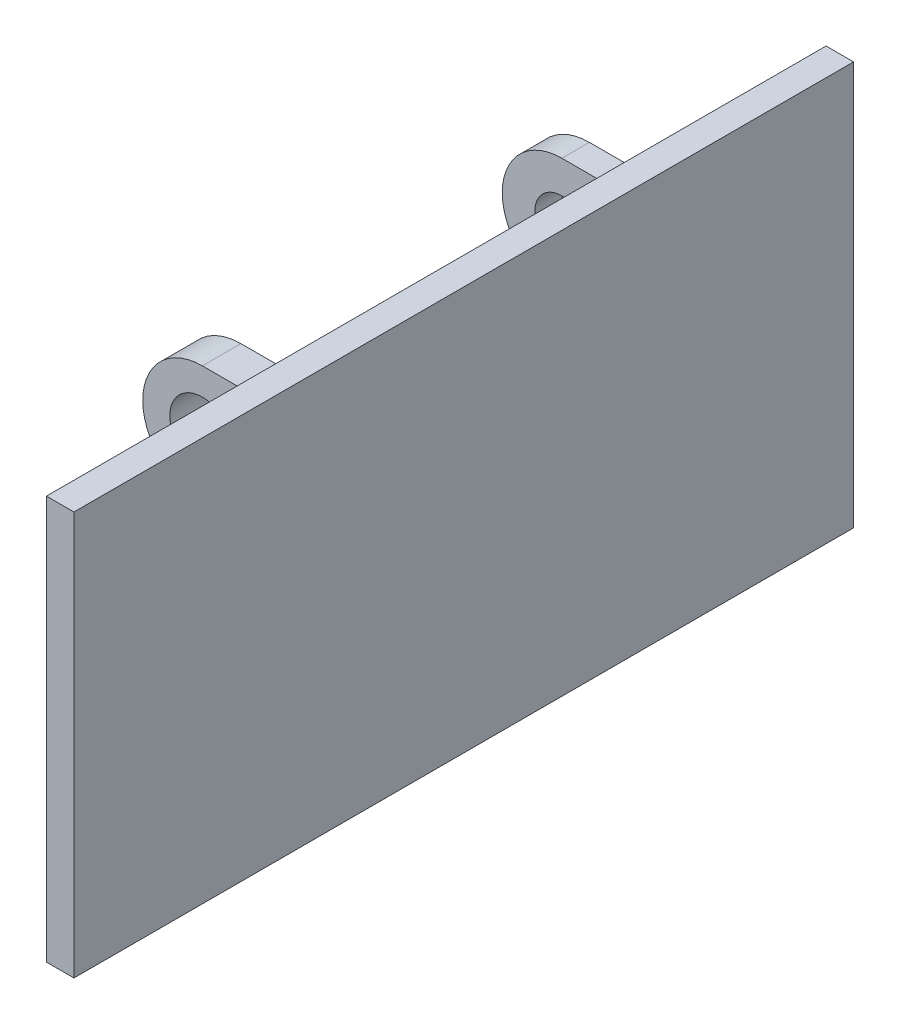
ISO-10303-21;
HEADER;
FILE_DESCRIPTION(('STEP AP214'),'2;1');
FILE_NAME('part.step','',(''),(''),'','','');
FILE_SCHEMA(('AUTOMOTIVE_DESIGN { 1 0 10303 214 1 1 1 1 }'));
ENDSEC;
DATA;
#1=APPLICATION_CONTEXT('core data for automotive mechanical design processes');
#2=APPLICATION_PROTOCOL_DEFINITION('international standard','automotive_design',2000,#1);
#3=PRODUCT_CONTEXT('',#1,'mechanical');
#4=PRODUCT('Part','Part','',(#3));
#5=PRODUCT_RELATED_PRODUCT_CATEGORY('part','',(#4));
#6=PRODUCT_DEFINITION_FORMATION('','',#4);
#7=PRODUCT_DEFINITION_CONTEXT('part definition',#1,'design');
#8=PRODUCT_DEFINITION('design','',#6,#7);
#9=PRODUCT_DEFINITION_SHAPE('','',#8);
#10=(LENGTH_UNIT() NAMED_UNIT(*) SI_UNIT(.MILLI.,.METRE.));
#11=(NAMED_UNIT(*) PLANE_ANGLE_UNIT() SI_UNIT($,.RADIAN.));
#12=(NAMED_UNIT(*) SI_UNIT($,.STERADIAN.) SOLID_ANGLE_UNIT());
#13=UNCERTAINTY_MEASURE_WITH_UNIT(LENGTH_MEASURE(1.E-05),#10,'distance_accuracy_value','');
#14=(GEOMETRIC_REPRESENTATION_CONTEXT(3) GLOBAL_UNCERTAINTY_ASSIGNED_CONTEXT((#13)) GLOBAL_UNIT_ASSIGNED_CONTEXT((#10,
#11,#12)) REPRESENTATION_CONTEXT('',''));
#15=CARTESIAN_POINT('',(0.,0.,0.));
#16=DIRECTION('',(0.,0.,1.));
#17=DIRECTION('',(1.,0.,0.));
#18=AXIS2_PLACEMENT_3D('',#15,#16,#17);
#19=CARTESIAN_POINT('',(122.,0.,0.));
#20=DIRECTION('',(-1.,0.,0.));
#21=DIRECTION('',(0.,0.,1.));
#22=AXIS2_PLACEMENT_3D('',#19,#20,#21);
#23=PLANE('',#22);
#24=DIRECTION('',(0.,-1.,0.));
#25=VECTOR('',#24,1.);
#26=CARTESIAN_POINT('',(122.,-46.,47.));
#27=LINE('',#26,#25);
#28=CARTESIAN_POINT('',(122.,-2.,47.));
#29=VERTEX_POINT('',#28);
#30=CARTESIAN_POINT('',(122.,-46.,47.));
#31=VERTEX_POINT('',#30);
#32=EDGE_CURVE('E261',#29,#31,#27,.T.);
#33=ORIENTED_EDGE('',*,*,#32,.F.);
#34=DIRECTION('',(0.,0.,1.));
#35=VECTOR('',#34,1.);
#36=CARTESIAN_POINT('',(122.,-2.,47.));
#37=LINE('',#36,#35);
#38=CARTESIAN_POINT('',(122.,-2.,-38.));
#39=VERTEX_POINT('',#38);
#40=EDGE_CURVE('E267',#39,#29,#37,.T.);
#41=ORIENTED_EDGE('',*,*,#40,.F.);
#42=DIRECTION('',(0.,1.,0.));
#43=VECTOR('',#42,1.);
#44=CARTESIAN_POINT('',(122.,-46.,-38.));
#45=LINE('',#44,#43);
#46=CARTESIAN_POINT('',(122.,-46.,-38.));
#47=VERTEX_POINT('',#46);
#48=EDGE_CURVE('E283',#47,#39,#45,.T.);
#49=ORIENTED_EDGE('',*,*,#48,.F.);
#50=DIRECTION('',(0.,0.,-1.));
#51=VECTOR('',#50,1.);
#52=CARTESIAN_POINT('',(122.,-46.,47.));
#53=LINE('',#52,#51);
#54=EDGE_CURVE('E280',#31,#47,#53,.T.);
#55=ORIENTED_EDGE('',*,*,#54,.F.);
#56=EDGE_LOOP('',(#33,#41,#49,#55));
#57=FACE_BOUND('',#56,.T.);
#58=DIRECTION('',(0.,0.,1.));
#59=VECTOR('',#58,1.);
#60=CARTESIAN_POINT('',(122.,-12.,0.));
#61=LINE('',#60,#59);
#62=CARTESIAN_POINT('',(122.,-12.,12.));
#63=VERTEX_POINT('',#62);
#64=CARTESIAN_POINT('',(122.,-12.,16.2));
#65=VERTEX_POINT('',#64);
#66=EDGE_CURVE('E307',#63,#65,#61,.T.);
#67=ORIENTED_EDGE('',*,*,#66,.T.);
#68=DIRECTION('',(0.,-1.,0.));
#69=VECTOR('',#68,1.);
#70=CARTESIAN_POINT('',(122.,0.,16.2));
#71=LINE('',#70,#69);
#72=CARTESIAN_POINT('',(122.,-25.,16.2));
#73=VERTEX_POINT('',#72);
#74=EDGE_CURVE('E313',#65,#73,#71,.T.);
#75=ORIENTED_EDGE('',*,*,#74,.T.);
#76=DIRECTION('',(0.,0.,-1.));
#77=VECTOR('',#76,1.);
#78=CARTESIAN_POINT('',(122.,-25.,0.));
#79=LINE('',#78,#77);
#80=CARTESIAN_POINT('',(122.,-25.,12.));
#81=VERTEX_POINT('',#80);
#82=EDGE_CURVE('E310',#73,#81,#79,.T.);
#83=ORIENTED_EDGE('',*,*,#82,.T.);
#84=DIRECTION('',(0.,-1.,0.));
#85=VECTOR('',#84,1.);
#86=CARTESIAN_POINT('',(122.,0.,12.));
#87=LINE('',#86,#85);
#88=EDGE_CURVE('E303',#63,#81,#87,.T.);
#89=ORIENTED_EDGE('',*,*,#88,.F.);
#90=EDGE_LOOP('',(#67,#75,#83,#89));
#91=FACE_BOUND('',#90,.T.);
#92=DIRECTION('',(0.,0.,1.));
#93=VECTOR('',#92,1.);
#94=CARTESIAN_POINT('',(122.,-12.,0.));
#95=LINE('',#94,#93);
#96=CARTESIAN_POINT('',(122.,-12.,-26.));
#97=VERTEX_POINT('',#96);
#98=CARTESIAN_POINT('',(122.,-12.,-23.));
#99=VERTEX_POINT('',#98);
#100=EDGE_CURVE('E58',#97,#99,#95,.T.);
#101=ORIENTED_EDGE('',*,*,#100,.T.);
#102=DIRECTION('',(0.,-1.,0.));
#103=VECTOR('',#102,1.);
#104=CARTESIAN_POINT('',(122.,0.,-23.));
#105=LINE('',#104,#103);
#106=CARTESIAN_POINT('',(122.,-25.,-23.));
#107=VERTEX_POINT('',#106);
#108=EDGE_CURVE('E11',#99,#107,#105,.T.);
#109=ORIENTED_EDGE('',*,*,#108,.T.);
#110=DIRECTION('',(0.,0.,-1.));
#111=VECTOR('',#110,1.);
#112=CARTESIAN_POINT('',(122.,-25.,0.));
#113=LINE('',#112,#111);
#114=CARTESIAN_POINT('',(122.,-25.,-26.));
#115=VERTEX_POINT('',#114);
#116=EDGE_CURVE('E48',#107,#115,#113,.T.);
#117=ORIENTED_EDGE('',*,*,#116,.T.);
#118=DIRECTION('',(0.,-1.,0.));
#119=VECTOR('',#118,1.);
#120=CARTESIAN_POINT('',(122.,0.,-26.));
#121=LINE('',#120,#119);
#122=EDGE_CURVE('E324',#97,#115,#121,.T.);
#123=ORIENTED_EDGE('',*,*,#122,.F.);
#124=EDGE_LOOP('',(#101,#109,#117,#123));
#125=FACE_BOUND('',#124,.T.);
#126=ADVANCED_FACE('F39',(#57,#91,#125),#23,.T.);
#127=CARTESIAN_POINT('',(125.,-46.,47.));
#128=DIRECTION('',(0.,0.,-1.));
#129=DIRECTION('',(-1.,0.,0.));
#130=AXIS2_PLACEMENT_3D('',#127,#128,#129);
#131=PLANE('',#130);
#132=ORIENTED_EDGE('',*,*,#32,.T.);
#133=DIRECTION('',(-1.,0.,0.));
#134=VECTOR('',#133,1.);
#135=CARTESIAN_POINT('',(125.,-46.,47.));
#136=LINE('',#135,#134);
#137=CARTESIAN_POINT('',(125.,-46.,47.));
#138=VERTEX_POINT('',#137);
#139=EDGE_CURVE('E299',#138,#31,#136,.T.);
#140=ORIENTED_EDGE('',*,*,#139,.F.);
#141=DIRECTION('',(0.,-1.,0.));
#142=VECTOR('',#141,1.);
#143=CARTESIAN_POINT('',(125.,-46.,47.));
#144=LINE('',#143,#142);
#145=CARTESIAN_POINT('',(125.,-2.,47.));
#146=VERTEX_POINT('',#145);
#147=EDGE_CURVE('E262',#146,#138,#144,.T.);
#148=ORIENTED_EDGE('',*,*,#147,.F.);
#149=DIRECTION('',(-1.,0.,0.));
#150=VECTOR('',#149,1.);
#151=CARTESIAN_POINT('',(125.,-2.,47.));
#152=LINE('',#151,#150);
#153=EDGE_CURVE('E276',#146,#29,#152,.T.);
#154=ORIENTED_EDGE('',*,*,#153,.T.);
#155=EDGE_LOOP('',(#132,#140,#148,#154));
#156=FACE_BOUND('',#155,.T.);
#157=ADVANCED_FACE('F41',(#156),#131,.F.);
#158=CARTESIAN_POINT('',(125.,-46.,47.));
#159=DIRECTION('',(0.,1.,0.));
#160=DIRECTION('',(0.,0.,1.));
#161=AXIS2_PLACEMENT_3D('',#158,#159,#160);
#162=PLANE('',#161);
#163=ORIENTED_EDGE('',*,*,#54,.T.);
#164=DIRECTION('',(-1.,0.,0.));
#165=VECTOR('',#164,1.);
#166=CARTESIAN_POINT('',(125.,-46.,-38.));
#167=LINE('',#166,#165);
#168=CARTESIAN_POINT('',(125.,-46.,-38.));
#169=VERTEX_POINT('',#168);
#170=EDGE_CURVE('E295',#169,#47,#167,.T.);
#171=ORIENTED_EDGE('',*,*,#170,.F.);
#172=DIRECTION('',(0.,0.,-1.));
#173=VECTOR('',#172,1.);
#174=CARTESIAN_POINT('',(125.,-46.,47.));
#175=LINE('',#174,#173);
#176=EDGE_CURVE('E266',#138,#169,#175,.T.);
#177=ORIENTED_EDGE('',*,*,#176,.F.);
#178=ORIENTED_EDGE('',*,*,#139,.T.);
#179=EDGE_LOOP('',(#163,#171,#177,#178));
#180=FACE_BOUND('',#179,.T.);
#181=ADVANCED_FACE('F351',(#180),#162,.F.);
#182=CARTESIAN_POINT('',(125.,-46.,-38.));
#183=DIRECTION('',(0.,0.,1.));
#184=DIRECTION('',(1.,0.,0.));
#185=AXIS2_PLACEMENT_3D('',#182,#183,#184);
#186=PLANE('',#185);
#187=ORIENTED_EDGE('',*,*,#48,.T.);
#188=DIRECTION('',(-1.,0.,0.));
#189=VECTOR('',#188,1.);
#190=CARTESIAN_POINT('',(125.,-2.,-38.));
#191=LINE('',#190,#189);
#192=CARTESIAN_POINT('',(125.,-2.,-38.));
#193=VERTEX_POINT('',#192);
#194=EDGE_CURVE('E291',#193,#39,#191,.T.);
#195=ORIENTED_EDGE('',*,*,#194,.F.);
#196=DIRECTION('',(0.,1.,0.));
#197=VECTOR('',#196,1.);
#198=CARTESIAN_POINT('',(125.,-46.,-38.));
#199=LINE('',#198,#197);
#200=EDGE_CURVE('E270',#169,#193,#199,.T.);
#201=ORIENTED_EDGE('',*,*,#200,.F.);
#202=ORIENTED_EDGE('',*,*,#170,.T.);
#203=EDGE_LOOP('',(#187,#195,#201,#202));
#204=FACE_BOUND('',#203,.T.);
#205=ADVANCED_FACE('F362',(#204),#186,.F.);
#206=CARTESIAN_POINT('',(125.,-2.,47.));
#207=DIRECTION('',(0.,-1.,0.));
#208=DIRECTION('',(0.,0.,-1.));
#209=AXIS2_PLACEMENT_3D('',#206,#207,#208);
#210=PLANE('',#209);
#211=ORIENTED_EDGE('',*,*,#40,.T.);
#212=ORIENTED_EDGE('',*,*,#153,.F.);
#213=DIRECTION('',(0.,0.,1.));
#214=VECTOR('',#213,1.);
#215=CARTESIAN_POINT('',(125.,-2.,47.));
#216=LINE('',#215,#214);
#217=EDGE_CURVE('E273',#193,#146,#216,.T.);
#218=ORIENTED_EDGE('',*,*,#217,.F.);
#219=ORIENTED_EDGE('',*,*,#194,.T.);
#220=EDGE_LOOP('',(#211,#212,#218,#219));
#221=FACE_BOUND('',#220,.T.);
#222=ADVANCED_FACE('F359',(#221),#210,.F.);
#223=CARTESIAN_POINT('',(125.,0.,0.));
#224=DIRECTION('',(-1.,0.,0.));
#225=DIRECTION('',(0.,0.,1.));
#226=AXIS2_PLACEMENT_3D('',#223,#224,#225);
#227=PLANE('',#226);
#228=ORIENTED_EDGE('',*,*,#147,.T.);
#229=ORIENTED_EDGE('',*,*,#176,.T.);
#230=ORIENTED_EDGE('',*,*,#200,.T.);
#231=ORIENTED_EDGE('',*,*,#217,.T.);
#232=EDGE_LOOP('',(#228,#229,#230,#231));
#233=FACE_BOUND('',#232,.T.);
#234=ADVANCED_FACE('F357',(#233),#227,.F.);
#235=CARTESIAN_POINT('',(108.2,-25.,16.2));
#236=DIRECTION('',(0.,1.,0.));
#237=DIRECTION('',(0.,0.,1.));
#238=AXIS2_PLACEMENT_3D('',#235,#236,#237);
#239=PLANE('',#238);
#240=ORIENTED_EDGE('',*,*,#82,.F.);
#241=DIRECTION('',(1.,0.,0.));
#242=VECTOR('',#241,1.);
#243=CARTESIAN_POINT('',(108.2,-25.,16.2));
#244=LINE('',#243,#242);
#245=CARTESIAN_POINT('',(108.2,-25.,16.2));
#246=VERTEX_POINT('',#245);
#247=EDGE_CURVE('E240',#246,#73,#244,.T.);
#248=ORIENTED_EDGE('',*,*,#247,.F.);
#249=DIRECTION('',(0.,0.,-1.));
#250=VECTOR('',#249,1.);
#251=CARTESIAN_POINT('',(108.2,-25.,16.2));
#252=LINE('',#251,#250);
#253=CARTESIAN_POINT('',(108.2,-25.,12.));
#254=VERTEX_POINT('',#253);
#255=EDGE_CURVE('E257',#246,#254,#252,.T.);
#256=ORIENTED_EDGE('',*,*,#255,.T.);
#257=DIRECTION('',(1.,0.,0.));
#258=VECTOR('',#257,1.);
#259=CARTESIAN_POINT('',(108.2,-25.,12.));
#260=LINE('',#259,#258);
#261=EDGE_CURVE('E236',#254,#81,#260,.T.);
#262=ORIENTED_EDGE('',*,*,#261,.T.);
#263=EDGE_LOOP('',(#240,#248,#256,#262));
#264=FACE_BOUND('',#263,.T.);
#265=ADVANCED_FACE('F381',(#264),#239,.F.);
#266=CARTESIAN_POINT('',(108.2,-12.,16.2));
#267=DIRECTION('',(0.,-1.,0.));
#268=DIRECTION('',(0.,0.,-1.));
#269=AXIS2_PLACEMENT_3D('',#266,#267,#268);
#270=PLANE('',#269);
#271=ORIENTED_EDGE('',*,*,#66,.F.);
#272=DIRECTION('',(-1.,0.,0.));
#273=VECTOR('',#272,1.);
#274=CARTESIAN_POINT('',(108.2,-12.,12.));
#275=LINE('',#274,#273);
#276=CARTESIAN_POINT('',(108.2,-12.,12.));
#277=VERTEX_POINT('',#276);
#278=EDGE_CURVE('E245',#63,#277,#275,.T.);
#279=ORIENTED_EDGE('',*,*,#278,.T.);
#280=DIRECTION('',(0.,0.,-1.));
#281=VECTOR('',#280,1.);
#282=CARTESIAN_POINT('',(108.2,-12.,16.2));
#283=LINE('',#282,#281);
#284=CARTESIAN_POINT('',(108.2,-12.,16.2));
#285=VERTEX_POINT('',#284);
#286=EDGE_CURVE('E248',#285,#277,#283,.T.);
#287=ORIENTED_EDGE('',*,*,#286,.F.);
#288=DIRECTION('',(-1.,0.,0.));
#289=VECTOR('',#288,1.);
#290=CARTESIAN_POINT('',(108.2,-12.,16.2));
#291=LINE('',#290,#289);
#292=EDGE_CURVE('E244',#65,#285,#291,.T.);
#293=ORIENTED_EDGE('',*,*,#292,.F.);
#294=EDGE_LOOP('',(#271,#279,#287,#293));
#295=FACE_BOUND('',#294,.T.);
#296=ADVANCED_FACE('F385',(#295),#270,.F.);
#297=CARTESIAN_POINT('',(0.,0.,16.2));
#298=DIRECTION('',(0.,0.,-1.));
#299=DIRECTION('',(-1.,0.,0.));
#300=AXIS2_PLACEMENT_3D('',#297,#298,#299);
#301=PLANE('',#300);
#302=CARTESIAN_POINT('',(108.2,-18.5,16.2));
#303=DIRECTION('',(0.,0.,1.));
#304=DIRECTION('',(1.,0.,0.));
#305=AXIS2_PLACEMENT_3D('',#302,#303,#304);
#306=CIRCLE('',#305,3.55);
#307=CARTESIAN_POINT('',(108.835894584196,-15.0074167042445,16.2));
#308=VERTEX_POINT('',#307);
#309=CARTESIAN_POINT('',(108.835894584196,-21.9925832957554,16.2));
#310=VERTEX_POINT('',#309);
#311=EDGE_CURVE('E222',#308,#310,#306,.T.);
#312=ORIENTED_EDGE('',*,*,#311,.F.);
#313=DIRECTION('',(-0.995948362239352,0.0899269689956982,0.));
#314=VECTOR('',#313,1.);
#315=CARTESIAN_POINT('',(108.2,-14.95,16.2));
#316=LINE('',#315,#314);
#317=CARTESIAN_POINT('',(120.9,-16.0967185946041,16.2));
#318=VERTEX_POINT('',#317);
#319=EDGE_CURVE('E202',#318,#308,#316,.T.);
#320=ORIENTED_EDGE('',*,*,#319,.F.);
#321=DIRECTION('',(0.,1.,0.));
#322=VECTOR('',#321,1.);
#323=CARTESIAN_POINT('',(120.9,-16.0967185946041,16.2));
#324=LINE('',#323,#322);
#325=CARTESIAN_POINT('',(120.9,-20.9032814053959,16.2));
#326=VERTEX_POINT('',#325);
#327=EDGE_CURVE('E213',#326,#318,#324,.T.);
#328=ORIENTED_EDGE('',*,*,#327,.F.);
#329=DIRECTION('',(0.995948362239352,0.0899269689956982,0.));
#330=VECTOR('',#329,1.);
#331=CARTESIAN_POINT('',(120.9,-20.9032814053959,16.2));
#332=LINE('',#331,#330);
#333=EDGE_CURVE('E196',#310,#326,#332,.T.);
#334=ORIENTED_EDGE('',*,*,#333,.F.);
#335=EDGE_LOOP('',(#312,#320,#328,#334));
#336=FACE_BOUND('',#335,.T.);
#337=ORIENTED_EDGE('',*,*,#292,.T.);
#338=CARTESIAN_POINT('',(108.2,-18.5,16.2));
#339=DIRECTION('',(0.,0.,1.));
#340=DIRECTION('',(1.,0.,0.));
#341=AXIS2_PLACEMENT_3D('',#338,#339,#340);
#342=CIRCLE('',#341,6.50000000000001);
#343=EDGE_CURVE('E232',#285,#246,#342,.T.);
#344=ORIENTED_EDGE('',*,*,#343,.T.);
#345=ORIENTED_EDGE('',*,*,#247,.T.);
#346=ORIENTED_EDGE('',*,*,#74,.F.);
#347=EDGE_LOOP('',(#337,#344,#345,#346));
#348=FACE_BOUND('',#347,.T.);
#349=ADVANCED_FACE('F390',(#336,#348),#301,.F.);
#350=CARTESIAN_POINT('',(0.,0.,12.));
#351=DIRECTION('',(0.,0.,-1.));
#352=DIRECTION('',(-1.,0.,0.));
#353=AXIS2_PLACEMENT_3D('',#350,#351,#352);
#354=PLANE('',#353);
#355=DIRECTION('',(-0.995948362239352,0.0899269689956982,0.));
#356=VECTOR('',#355,1.);
#357=CARTESIAN_POINT('',(108.2,-14.95,12.));
#358=LINE('',#357,#356);
#359=CARTESIAN_POINT('',(120.9,-16.0967185946041,12.));
#360=VERTEX_POINT('',#359);
#361=CARTESIAN_POINT('',(108.835894584196,-15.0074167042445,12.));
#362=VERTEX_POINT('',#361);
#363=EDGE_CURVE('E206',#360,#362,#358,.T.);
#364=ORIENTED_EDGE('',*,*,#363,.T.);
#365=CARTESIAN_POINT('',(108.2,-18.5,12.));
#366=DIRECTION('',(0.,0.,1.));
#367=DIRECTION('',(1.,0.,0.));
#368=AXIS2_PLACEMENT_3D('',#365,#366,#367);
#369=CIRCLE('',#368,3.55);
#370=CARTESIAN_POINT('',(108.835894584196,-21.9925832957555,12.));
#371=VERTEX_POINT('',#370);
#372=EDGE_CURVE('E226',#362,#371,#369,.T.);
#373=ORIENTED_EDGE('',*,*,#372,.T.);
#374=DIRECTION('',(0.995948362239352,0.0899269689956982,0.));
#375=VECTOR('',#374,1.);
#376=CARTESIAN_POINT('',(120.9,-20.9032814053959,12.));
#377=LINE('',#376,#375);
#378=CARTESIAN_POINT('',(120.9,-20.9032814053959,12.));
#379=VERTEX_POINT('',#378);
#380=EDGE_CURVE('E197',#371,#379,#377,.T.);
#381=ORIENTED_EDGE('',*,*,#380,.T.);
#382=DIRECTION('',(0.,1.,0.));
#383=VECTOR('',#382,1.);
#384=CARTESIAN_POINT('',(120.9,-16.0967185946041,12.));
#385=LINE('',#384,#383);
#386=EDGE_CURVE('E201',#379,#360,#385,.T.);
#387=ORIENTED_EDGE('',*,*,#386,.T.);
#388=EDGE_LOOP('',(#364,#373,#381,#387));
#389=FACE_BOUND('',#388,.T.);
#390=ORIENTED_EDGE('',*,*,#261,.F.);
#391=CARTESIAN_POINT('',(108.2,-18.5,12.));
#392=DIRECTION('',(0.,0.,1.));
#393=DIRECTION('',(1.,0.,0.));
#394=AXIS2_PLACEMENT_3D('',#391,#392,#393);
#395=CIRCLE('',#394,6.50000000000001);
#396=EDGE_CURVE('E229',#277,#254,#395,.T.);
#397=ORIENTED_EDGE('',*,*,#396,.F.);
#398=ORIENTED_EDGE('',*,*,#278,.F.);
#399=ORIENTED_EDGE('',*,*,#88,.T.);
#400=EDGE_LOOP('',(#390,#397,#398,#399));
#401=FACE_BOUND('',#400,.T.);
#402=ADVANCED_FACE('F395',(#389,#401),#354,.T.);
#403=CARTESIAN_POINT('',(108.2,-18.5,16.2));
#404=DIRECTION('',(0.,0.,-1.));
#405=DIRECTION('',(-1.,0.,0.));
#406=AXIS2_PLACEMENT_3D('',#403,#404,#405);
#407=CYLINDRICAL_SURFACE('',#406,6.50000000000001);
#408=ORIENTED_EDGE('',*,*,#396,.T.);
#409=ORIENTED_EDGE('',*,*,#255,.F.);
#410=ORIENTED_EDGE('',*,*,#343,.F.);
#411=ORIENTED_EDGE('',*,*,#286,.T.);
#412=EDGE_LOOP('',(#408,#409,#410,#411));
#413=FACE_BOUND('',#412,.T.);
#414=ADVANCED_FACE('F398',(#413),#407,.T.);
#415=CARTESIAN_POINT('',(108.2,-18.5,12.));
#416=DIRECTION('',(0.,0.,1.));
#417=DIRECTION('',(1.,0.,0.));
#418=AXIS2_PLACEMENT_3D('',#415,#416,#417);
#419=CYLINDRICAL_SURFACE('',#418,3.55);
#420=ORIENTED_EDGE('',*,*,#311,.T.);
#421=DIRECTION('',(0.,0.,1.));
#422=VECTOR('',#421,1.);
#423=CARTESIAN_POINT('',(108.835894584196,-21.9925832957554,12.));
#424=LINE('',#423,#422);
#425=EDGE_CURVE('E316',#310,#371,#424,.F.);
#426=ORIENTED_EDGE('',*,*,#425,.T.);
#427=ORIENTED_EDGE('',*,*,#372,.F.);
#428=DIRECTION('',(0.,0.,1.));
#429=VECTOR('',#428,1.);
#430=CARTESIAN_POINT('',(108.835894584196,-15.0074167042445,12.));
#431=LINE('',#430,#429);
#432=EDGE_CURVE('E320',#362,#308,#431,.T.);
#433=ORIENTED_EDGE('',*,*,#432,.T.);
#434=EDGE_LOOP('',(#420,#426,#427,#433));
#435=FACE_BOUND('',#434,.T.);
#436=ADVANCED_FACE('F405',(#435),#419,.F.);
#437=CARTESIAN_POINT('',(108.2,-14.95,12.));
#438=DIRECTION('',(0.0899269689956982,0.995948362239352,0.));
#439=DIRECTION('',(-0.995948362239352,0.0899269689956982,0.));
#440=AXIS2_PLACEMENT_3D('',#437,#438,#439);
#441=PLANE('',#440);
#442=ORIENTED_EDGE('',*,*,#363,.F.);
#443=DIRECTION('',(0.,0.,1.));
#444=VECTOR('',#443,1.);
#445=CARTESIAN_POINT('',(120.9,-16.0967185946041,12.));
#446=LINE('',#445,#444);
#447=EDGE_CURVE('E219',#360,#318,#446,.T.);
#448=ORIENTED_EDGE('',*,*,#447,.T.);
#449=ORIENTED_EDGE('',*,*,#319,.T.);
#450=ORIENTED_EDGE('',*,*,#432,.F.);
#451=EDGE_LOOP('',(#442,#448,#449,#450));
#452=FACE_BOUND('',#451,.T.);
#453=ADVANCED_FACE('F409',(#452),#441,.F.);
#454=CARTESIAN_POINT('',(120.9,-20.9032814053959,12.));
#455=DIRECTION('',(0.0899269689956982,-0.995948362239352,0.));
#456=DIRECTION('',(0.995948362239352,0.0899269689956982,0.));
#457=AXIS2_PLACEMENT_3D('',#454,#455,#456);
#458=PLANE('',#457);
#459=ORIENTED_EDGE('',*,*,#333,.T.);
#460=DIRECTION('',(0.,0.,1.));
#461=VECTOR('',#460,1.);
#462=CARTESIAN_POINT('',(120.9,-20.9032814053959,12.));
#463=LINE('',#462,#461);
#464=EDGE_CURVE('E210',#379,#326,#463,.T.);
#465=ORIENTED_EDGE('',*,*,#464,.F.);
#466=ORIENTED_EDGE('',*,*,#380,.F.);
#467=ORIENTED_EDGE('',*,*,#425,.F.);
#468=EDGE_LOOP('',(#459,#465,#466,#467));
#469=FACE_BOUND('',#468,.T.);
#470=ADVANCED_FACE('F411',(#469),#458,.F.);
#471=CARTESIAN_POINT('',(120.9,-16.0967185946041,12.));
#472=DIRECTION('',(1.,0.,0.));
#473=DIRECTION('',(0.,0.,-1.));
#474=AXIS2_PLACEMENT_3D('',#471,#472,#473);
#475=PLANE('',#474);
#476=ORIENTED_EDGE('',*,*,#327,.T.);
#477=ORIENTED_EDGE('',*,*,#447,.F.);
#478=ORIENTED_EDGE('',*,*,#386,.F.);
#479=ORIENTED_EDGE('',*,*,#464,.T.);
#480=EDGE_LOOP('',(#476,#477,#478,#479));
#481=FACE_BOUND('',#480,.T.);
#482=ADVANCED_FACE('F414',(#481),#475,.F.);
#483=CARTESIAN_POINT('',(108.2,-25.,-23.));
#484=DIRECTION('',(0.,1.,0.));
#485=DIRECTION('',(0.,0.,1.));
#486=AXIS2_PLACEMENT_3D('',#483,#484,#485);
#487=PLANE('',#486);
#488=ORIENTED_EDGE('',*,*,#116,.F.);
#489=DIRECTION('',(1.,0.,0.));
#490=VECTOR('',#489,1.);
#491=CARTESIAN_POINT('',(108.2,-25.,-23.));
#492=LINE('',#491,#490);
#493=CARTESIAN_POINT('',(108.2,-25.,-23.));
#494=VERTEX_POINT('',#493);
#495=EDGE_CURVE('E159',#494,#107,#492,.T.);
#496=ORIENTED_EDGE('',*,*,#495,.F.);
#497=DIRECTION('',(0.,0.,-1.));
#498=VECTOR('',#497,1.);
#499=CARTESIAN_POINT('',(108.2,-25.,-23.));
#500=LINE('',#499,#498);
#501=CARTESIAN_POINT('',(108.2,-25.,-26.));
#502=VERTEX_POINT('',#501);
#503=EDGE_CURVE('E170',#494,#502,#500,.T.);
#504=ORIENTED_EDGE('',*,*,#503,.T.);
#505=DIRECTION('',(1.,0.,0.));
#506=VECTOR('',#505,1.);
#507=CARTESIAN_POINT('',(108.2,-25.,-26.));
#508=LINE('',#507,#506);
#509=EDGE_CURVE('E160',#502,#115,#508,.T.);
#510=ORIENTED_EDGE('',*,*,#509,.T.);
#511=EDGE_LOOP('',(#488,#496,#504,#510));
#512=FACE_BOUND('',#511,.T.);
#513=ADVANCED_FACE('F330',(#512),#487,.F.);
#514=CARTESIAN_POINT('',(108.2,-12.,-23.));
#515=DIRECTION('',(0.,-1.,0.));
#516=DIRECTION('',(0.,0.,-1.));
#517=AXIS2_PLACEMENT_3D('',#514,#515,#516);
#518=PLANE('',#517);
#519=ORIENTED_EDGE('',*,*,#100,.F.);
#520=DIRECTION('',(-1.,0.,0.));
#521=VECTOR('',#520,1.);
#522=CARTESIAN_POINT('',(108.2,-12.,-26.));
#523=LINE('',#522,#521);
#524=CARTESIAN_POINT('',(108.2,-12.,-26.));
#525=VERTEX_POINT('',#524);
#526=EDGE_CURVE('E149',#97,#525,#523,.T.);
#527=ORIENTED_EDGE('',*,*,#526,.T.);
#528=DIRECTION('',(0.,0.,-1.));
#529=VECTOR('',#528,1.);
#530=CARTESIAN_POINT('',(108.2,-12.,-23.));
#531=LINE('',#530,#529);
#532=CARTESIAN_POINT('',(108.2,-12.,-23.));
#533=VERTEX_POINT('',#532);
#534=EDGE_CURVE('E153',#533,#525,#531,.T.);
#535=ORIENTED_EDGE('',*,*,#534,.F.);
#536=DIRECTION('',(-1.,0.,0.));
#537=VECTOR('',#536,1.);
#538=CARTESIAN_POINT('',(108.2,-12.,-23.));
#539=LINE('',#538,#537);
#540=EDGE_CURVE('E171',#99,#533,#539,.T.);
#541=ORIENTED_EDGE('',*,*,#540,.F.);
#542=EDGE_LOOP('',(#519,#527,#535,#541));
#543=FACE_BOUND('',#542,.T.);
#544=ADVANCED_FACE('F151',(#543),#518,.F.);
#545=CARTESIAN_POINT('',(0.,0.,-23.));
#546=DIRECTION('',(0.,0.,-1.));
#547=DIRECTION('',(-1.,0.,0.));
#548=AXIS2_PLACEMENT_3D('',#545,#546,#547);
#549=PLANE('',#548);
#550=CARTESIAN_POINT('',(108.2,-18.5,-23.));
#551=DIRECTION('',(0.,0.,1.));
#552=DIRECTION('',(1.,0.,0.));
#553=AXIS2_PLACEMENT_3D('',#550,#551,#552);
#554=CIRCLE('',#553,2.94999999999999);
#555=CARTESIAN_POINT('',(111.15,-18.5,-23.));
#556=VERTEX_POINT('',#555);
#557=EDGE_CURVE('E183',#556,#556,#554,.T.);
#558=ORIENTED_EDGE('',*,*,#557,.F.);
#559=EDGE_LOOP('',(#558));
#560=FACE_BOUND('',#559,.T.);
#561=ORIENTED_EDGE('',*,*,#540,.T.);
#562=CARTESIAN_POINT('',(108.2,-18.5,-23.));
#563=DIRECTION('',(0.,0.,1.));
#564=DIRECTION('',(1.,0.,0.));
#565=AXIS2_PLACEMENT_3D('',#562,#563,#564);
#566=CIRCLE('',#565,6.50000000000001);
#567=EDGE_CURVE('E168',#533,#494,#566,.T.);
#568=ORIENTED_EDGE('',*,*,#567,.T.);
#569=ORIENTED_EDGE('',*,*,#495,.T.);
#570=ORIENTED_EDGE('',*,*,#108,.F.);
#571=EDGE_LOOP('',(#561,#568,#569,#570));
#572=FACE_BOUND('',#571,.T.);
#573=ADVANCED_FACE('F332',(#560,#572),#549,.F.);
#574=CARTESIAN_POINT('',(0.,0.,-26.));
#575=DIRECTION('',(0.,0.,-1.));
#576=DIRECTION('',(-1.,0.,0.));
#577=AXIS2_PLACEMENT_3D('',#574,#575,#576);
#578=PLANE('',#577);
#579=CARTESIAN_POINT('',(108.2,-18.5,-26.));
#580=DIRECTION('',(0.,0.,1.));
#581=DIRECTION('',(1.,0.,0.));
#582=AXIS2_PLACEMENT_3D('',#579,#580,#581);
#583=CIRCLE('',#582,2.94999999999999);
#584=CARTESIAN_POINT('',(111.15,-18.5,-26.));
#585=VERTEX_POINT('',#584);
#586=EDGE_CURVE('E177',#585,#585,#583,.T.);
#587=ORIENTED_EDGE('',*,*,#586,.T.);
#588=EDGE_LOOP('',(#587));
#589=FACE_BOUND('',#588,.T.);
#590=ORIENTED_EDGE('',*,*,#509,.F.);
#591=CARTESIAN_POINT('',(108.2,-18.5,-26.));
#592=DIRECTION('',(0.,0.,1.));
#593=DIRECTION('',(1.,0.,0.));
#594=AXIS2_PLACEMENT_3D('',#591,#592,#593);
#595=CIRCLE('',#594,6.50000000000001);
#596=EDGE_CURVE('E166',#525,#502,#595,.T.);
#597=ORIENTED_EDGE('',*,*,#596,.F.);
#598=ORIENTED_EDGE('',*,*,#526,.F.);
#599=ORIENTED_EDGE('',*,*,#122,.T.);
#600=EDGE_LOOP('',(#590,#597,#598,#599));
#601=FACE_BOUND('',#600,.T.);
#602=ADVANCED_FACE('F173',(#589,#601),#578,.T.);
#603=CARTESIAN_POINT('',(108.2,-18.5,-23.));
#604=DIRECTION('',(0.,0.,-1.));
#605=DIRECTION('',(-1.,0.,0.));
#606=AXIS2_PLACEMENT_3D('',#603,#604,#605);
#607=CYLINDRICAL_SURFACE('',#606,6.50000000000001);
#608=ORIENTED_EDGE('',*,*,#596,.T.);
#609=ORIENTED_EDGE('',*,*,#503,.F.);
#610=ORIENTED_EDGE('',*,*,#567,.F.);
#611=ORIENTED_EDGE('',*,*,#534,.T.);
#612=EDGE_LOOP('',(#608,#609,#610,#611));
#613=FACE_BOUND('',#612,.T.);
#614=ADVANCED_FACE('F164',(#613),#607,.T.);
#615=CARTESIAN_POINT('',(108.2,-18.5,-26.));
#616=DIRECTION('',(0.,0.,1.));
#617=DIRECTION('',(1.,0.,0.));
#618=AXIS2_PLACEMENT_3D('',#615,#616,#617);
#619=CYLINDRICAL_SURFACE('',#618,2.94999999999999);
#620=CARTESIAN_POINT('',(111.15,-18.5,-26.));
#621=CARTESIAN_POINT('',(111.15,-18.5,-25.96875));
#622=CARTESIAN_POINT('',(111.15,-18.5,-25.9375));
#623=CARTESIAN_POINT('',(111.15,-18.5,-25.875));
#624=CARTESIAN_POINT('',(111.15,-18.5,-25.84375));
#625=CARTESIAN_POINT('',(111.15,-18.5,-25.78125));
#626=CARTESIAN_POINT('',(111.15,-18.5,-25.75));
#627=CARTESIAN_POINT('',(111.15,-18.5,-25.6875));
#628=CARTESIAN_POINT('',(111.15,-18.5,-25.65625));
#629=CARTESIAN_POINT('',(111.15,-18.5,-25.59375));
#630=CARTESIAN_POINT('',(111.15,-18.5,-25.5625));
#631=CARTESIAN_POINT('',(111.15,-18.5,-25.5));
#632=CARTESIAN_POINT('',(111.15,-18.5,-25.46875));
#633=CARTESIAN_POINT('',(111.15,-18.5,-25.40625));
#634=CARTESIAN_POINT('',(111.15,-18.5,-25.375));
#635=CARTESIAN_POINT('',(111.15,-18.5,-25.3125));
#636=CARTESIAN_POINT('',(111.15,-18.5,-25.28125));
#637=CARTESIAN_POINT('',(111.15,-18.5,-25.21875));
#638=CARTESIAN_POINT('',(111.15,-18.5,-25.1875));
#639=CARTESIAN_POINT('',(111.15,-18.5,-25.125));
#640=CARTESIAN_POINT('',(111.15,-18.5,-25.09375));
#641=CARTESIAN_POINT('',(111.15,-18.5,-25.03125));
#642=CARTESIAN_POINT('',(111.15,-18.5,-25.));
#643=CARTESIAN_POINT('',(111.15,-18.5,-24.9375));
#644=CARTESIAN_POINT('',(111.15,-18.5,-24.90625));
#645=CARTESIAN_POINT('',(111.15,-18.5,-24.84375));
#646=CARTESIAN_POINT('',(111.15,-18.5,-24.8125));
#647=CARTESIAN_POINT('',(111.15,-18.5,-24.75));
#648=CARTESIAN_POINT('',(111.15,-18.5,-24.71875));
#649=CARTESIAN_POINT('',(111.15,-18.5,-24.65625));
#650=CARTESIAN_POINT('',(111.15,-18.5,-24.625));
#651=CARTESIAN_POINT('',(111.15,-18.5,-24.5625));
#652=CARTESIAN_POINT('',(111.15,-18.5,-24.53125));
#653=CARTESIAN_POINT('',(111.15,-18.5,-24.46875));
#654=CARTESIAN_POINT('',(111.15,-18.5,-24.4375));
#655=CARTESIAN_POINT('',(111.15,-18.5,-24.375));
#656=CARTESIAN_POINT('',(111.15,-18.5,-24.34375));
#657=CARTESIAN_POINT('',(111.15,-18.5,-24.28125));
#658=CARTESIAN_POINT('',(111.15,-18.5,-24.25));
#659=CARTESIAN_POINT('',(111.15,-18.5,-24.1875));
#660=CARTESIAN_POINT('',(111.15,-18.5,-24.15625));
#661=CARTESIAN_POINT('',(111.15,-18.5,-24.09375));
#662=CARTESIAN_POINT('',(111.15,-18.5,-24.0625));
#663=CARTESIAN_POINT('',(111.15,-18.5,-24.));
#664=CARTESIAN_POINT('',(111.15,-18.5,-23.96875));
#665=CARTESIAN_POINT('',(111.15,-18.5,-23.90625));
#666=CARTESIAN_POINT('',(111.15,-18.5,-23.875));
#667=CARTESIAN_POINT('',(111.15,-18.5,-23.8125));
#668=CARTESIAN_POINT('',(111.15,-18.5,-23.78125));
#669=CARTESIAN_POINT('',(111.15,-18.5,-23.71875));
#670=CARTESIAN_POINT('',(111.15,-18.5,-23.6875));
#671=CARTESIAN_POINT('',(111.15,-18.5,-23.625));
#672=CARTESIAN_POINT('',(111.15,-18.5,-23.59375));
#673=CARTESIAN_POINT('',(111.15,-18.5,-23.53125));
#674=CARTESIAN_POINT('',(111.15,-18.5,-23.5));
#675=CARTESIAN_POINT('',(111.15,-18.5,-23.4375));
#676=CARTESIAN_POINT('',(111.15,-18.5,-23.40625));
#677=CARTESIAN_POINT('',(111.15,-18.5,-23.34375));
#678=CARTESIAN_POINT('',(111.15,-18.5,-23.3125));
#679=CARTESIAN_POINT('',(111.15,-18.5,-23.25));
#680=CARTESIAN_POINT('',(111.15,-18.5,-23.21875));
#681=CARTESIAN_POINT('',(111.15,-18.5,-23.15625));
#682=CARTESIAN_POINT('',(111.15,-18.5,-23.125));
#683=CARTESIAN_POINT('',(111.15,-18.5,-23.0625));
#684=CARTESIAN_POINT('',(111.15,-18.5,-23.03125));
#685=CARTESIAN_POINT('',(111.15,-18.5,-23.));
#686=B_SPLINE_CURVE_WITH_KNOTS('',3,(#620,#621,#622,#623,#624,#625,#626,#627,#628,#629,#630,
#631,#632,#633,#634,#635,#636,#637,#638,#639,#640,#641,#642,#643,#644,#645,#646,#647,#648,#649,
#650,#651,#652,#653,#654,#655,#656,#657,#658,#659,#660,#661,#662,#663,#664,#665,#666,#667,#668,
#669,#670,#671,#672,#673,#674,#675,#676,#677,#678,#679,#680,#681,#682,#683,#684,#685),
.UNSPECIFIED.,.F.,.F.,(4,2,2,2,2,2,2,2,2,2,2,2,2,2,2,2,2,2,2,2,2,2,2,2,2,2,2,2,2,2,2,2,4),(0.,
0.0937500000000001,0.1875,0.28125,0.375,0.46875,0.5625,0.656250000000001,0.750000000000001,
0.843750000000001,0.937500000000001,1.03125,1.125,1.21875,1.3125,1.40625,1.5,1.59375,1.6875,
1.78125,1.875,1.96875,2.0625,2.15625,2.25,2.34375,2.4375,2.53125,2.625,2.71875,2.8125,2.90625,
3.),.UNSPECIFIED.);
#687=EDGE_CURVE('BSEAM440',#585,#556,#686,.T.);
#688=ORIENTED_EDGE('',*,*,#586,.F.);
#689=ORIENTED_EDGE('',*,*,#557,.T.);
#690=ORIENTED_EDGE('',*,*,#687,.T.);
#691=ORIENTED_EDGE('',*,*,#687,.F.);
#692=EDGE_LOOP('',(#688,#690,#689,#691));
#693=FACE_BOUND('',#692,.T.);
#694=ADVANCED_FACE('F440',(#693),#619,.F.);
#695=CLOSED_SHELL('',(#126,#157,#181,#205,#222,#234,#265,#296,#349,#402,#414,#436,#453,#470,
#482,#513,#544,#573,#602,#614,#694));
#696=MANIFOLD_SOLID_BREP('B2',#695);
#697=ADVANCED_BREP_SHAPE_REPRESENTATION('',(#18,#696),#14);
#698=SHAPE_DEFINITION_REPRESENTATION(#9,#697);
ENDSEC;
END-ISO-10303-21;
